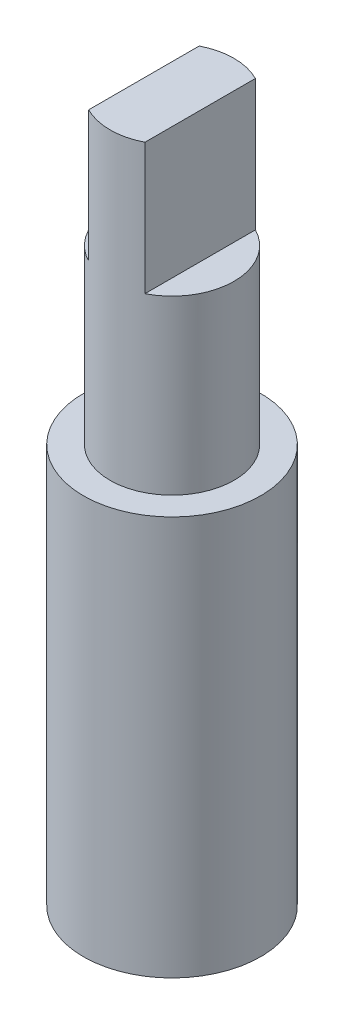
ISO-10303-21;
HEADER;
FILE_DESCRIPTION(('STEP AP214'),'2;1');
FILE_NAME('part.step','',(''),(''),'','','');
FILE_SCHEMA(('AUTOMOTIVE_DESIGN { 1 0 10303 214 1 1 1 1 }'));
ENDSEC;
DATA;
#1=APPLICATION_CONTEXT('core data for automotive mechanical design processes');
#2=APPLICATION_PROTOCOL_DEFINITION('international standard','automotive_design',2000,#1);
#3=PRODUCT_CONTEXT('',#1,'mechanical');
#4=PRODUCT('Part','Part','',(#3));
#5=PRODUCT_RELATED_PRODUCT_CATEGORY('part','',(#4));
#6=PRODUCT_DEFINITION_FORMATION('','',#4);
#7=PRODUCT_DEFINITION_CONTEXT('part definition',#1,'design');
#8=PRODUCT_DEFINITION('design','',#6,#7);
#9=PRODUCT_DEFINITION_SHAPE('','',#8);
#10=(LENGTH_UNIT() NAMED_UNIT(*) SI_UNIT(.MILLI.,.METRE.));
#11=(NAMED_UNIT(*) PLANE_ANGLE_UNIT() SI_UNIT($,.RADIAN.));
#12=(NAMED_UNIT(*) SI_UNIT($,.STERADIAN.) SOLID_ANGLE_UNIT());
#13=UNCERTAINTY_MEASURE_WITH_UNIT(LENGTH_MEASURE(1.E-05),#10,'distance_accuracy_value','');
#14=(GEOMETRIC_REPRESENTATION_CONTEXT(3) GLOBAL_UNCERTAINTY_ASSIGNED_CONTEXT((#13)) GLOBAL_UNIT_ASSIGNED_CONTEXT((#10,
#11,#12)) REPRESENTATION_CONTEXT('',''));
#15=CARTESIAN_POINT('',(0.,0.,0.));
#16=DIRECTION('',(0.,0.,1.));
#17=DIRECTION('',(1.,0.,0.));
#18=AXIS2_PLACEMENT_3D('',#15,#16,#17);
#19=CARTESIAN_POINT('',(0.,19.83,0.));
#20=DIRECTION('',(0.,1.,0.));
#21=DIRECTION('',(0.,0.,1.));
#22=AXIS2_PLACEMENT_3D('',#19,#20,#21);
#23=PLANE('',#22);
#24=DIRECTION('',(0.,0.,-1.));
#25=VECTOR('',#24,1.);
#26=CARTESIAN_POINT('',(0.975,19.83,-1.91621371459449));
#27=LINE('',#26,#25);
#28=CARTESIAN_POINT('',(0.975,19.83,1.91621371459449));
#29=VERTEX_POINT('',#28);
#30=CARTESIAN_POINT('',(0.975,19.83,-1.91621371459449));
#31=VERTEX_POINT('',#30);
#32=EDGE_CURVE('E104',#29,#31,#27,.T.);
#33=ORIENTED_EDGE('',*,*,#32,.F.);
#34=CARTESIAN_POINT('',(0.,19.83,0.));
#35=DIRECTION('',(0.,1.,0.));
#36=DIRECTION('',(0.,0.,1.));
#37=AXIS2_PLACEMENT_3D('',#34,#35,#36);
#38=CIRCLE('',#37,2.15);
#39=EDGE_CURVE('E63',#29,#31,#38,.T.);
#40=ORIENTED_EDGE('',*,*,#39,.T.);
#41=EDGE_LOOP('',(#33,#40));
#42=FACE_BOUND('',#41,.T.);
#43=ADVANCED_FACE('F39',(#42),#23,.T.);
#44=CARTESIAN_POINT('',(0.,13.85,0.));
#45=DIRECTION('',(0.,-1.,0.));
#46=DIRECTION('',(0.,0.,-1.));
#47=AXIS2_PLACEMENT_3D('',#44,#45,#46);
#48=CYLINDRICAL_SURFACE('',#47,3.075);
#49=CARTESIAN_POINT('',(0.,13.85,0.));
#50=DIRECTION('',(0.,1.,0.));
#51=DIRECTION('',(0.,0.,1.));
#52=AXIS2_PLACEMENT_3D('',#49,#50,#51);
#53=CIRCLE('',#52,3.075);
#54=CARTESIAN_POINT('',(0.,13.85,3.075));
#55=VERTEX_POINT('',#54);
#56=EDGE_CURVE('E49',#55,#55,#53,.T.);
#57=ORIENTED_EDGE('',*,*,#56,.F.);
#58=EDGE_LOOP('',(#57));
#59=FACE_BOUND('',#58,.T.);
#60=CARTESIAN_POINT('',(0.,0.,0.));
#61=DIRECTION('',(0.,1.,0.));
#62=DIRECTION('',(0.,0.,1.));
#63=AXIS2_PLACEMENT_3D('',#60,#61,#62);
#64=CIRCLE('',#63,3.075);
#65=CARTESIAN_POINT('',(0.,0.,3.075));
#66=VERTEX_POINT('',#65);
#67=EDGE_CURVE('E43',#66,#66,#64,.T.);
#68=ORIENTED_EDGE('',*,*,#67,.T.);
#69=EDGE_LOOP('',(#68));
#70=FACE_BOUND('',#69,.T.);
#71=ADVANCED_FACE('F41',(#59,#70),#48,.T.);
#72=CARTESIAN_POINT('',(0.,13.85,0.));
#73=DIRECTION('',(0.,1.,0.));
#74=DIRECTION('',(0.,0.,1.));
#75=AXIS2_PLACEMENT_3D('',#72,#73,#74);
#76=PLANE('',#75);
#77=CARTESIAN_POINT('',(0.,13.85,0.));
#78=DIRECTION('',(0.,1.,0.));
#79=DIRECTION('',(0.,0.,1.));
#80=AXIS2_PLACEMENT_3D('',#77,#78,#79);
#81=CIRCLE('',#80,2.15);
#82=CARTESIAN_POINT('',(0.,13.85,2.15));
#83=VERTEX_POINT('',#82);
#84=EDGE_CURVE('E11',#83,#83,#81,.T.);
#85=ORIENTED_EDGE('',*,*,#84,.F.);
#86=EDGE_LOOP('',(#85));
#87=FACE_BOUND('',#86,.T.);
#88=ORIENTED_EDGE('',*,*,#56,.T.);
#89=EDGE_LOOP('',(#88));
#90=FACE_BOUND('',#89,.T.);
#91=ADVANCED_FACE('F129',(#87,#90),#76,.T.);
#92=CARTESIAN_POINT('',(0.,0.,0.));
#93=DIRECTION('',(0.,1.,0.));
#94=DIRECTION('',(0.,0.,1.));
#95=AXIS2_PLACEMENT_3D('',#92,#93,#94);
#96=PLANE('',#95);
#97=CARTESIAN_POINT('',(0.,0.,0.));
#98=DIRECTION('',(0.,-1.,0.));
#99=DIRECTION('',(0.,0.,-1.));
#100=AXIS2_PLACEMENT_3D('',#97,#98,#99);
#101=CIRCLE('',#100,2.15);
#102=CARTESIAN_POINT('',(0.,0.,-2.15));
#103=VERTEX_POINT('',#102);
#104=EDGE_CURVE('E173',#103,#103,#101,.T.);
#105=ORIENTED_EDGE('',*,*,#104,.F.);
#106=EDGE_LOOP('',(#105));
#107=FACE_BOUND('',#106,.T.);
#108=ORIENTED_EDGE('',*,*,#67,.F.);
#109=EDGE_LOOP('',(#108));
#110=FACE_BOUND('',#109,.T.);
#111=ADVANCED_FACE('F127',(#107,#110),#96,.F.);
#112=CARTESIAN_POINT('',(0.,19.83,0.));
#113=DIRECTION('',(0.,-1.,0.));
#114=DIRECTION('',(0.,0.,-1.));
#115=AXIS2_PLACEMENT_3D('',#112,#113,#114);
#116=CYLINDRICAL_SURFACE('',#115,2.15);
#117=ORIENTED_EDGE('',*,*,#39,.F.);
#118=DIRECTION('',(0.,-1.,0.));
#119=VECTOR('',#118,1.);
#120=CARTESIAN_POINT('',(0.975,24.38,1.91621371459449));
#121=LINE('',#120,#119);
#122=CARTESIAN_POINT('',(0.975,24.38,1.91621371459449));
#123=VERTEX_POINT('',#122);
#124=EDGE_CURVE('E114',#123,#29,#121,.T.);
#125=ORIENTED_EDGE('',*,*,#124,.F.);
#126=CARTESIAN_POINT('',(0.,24.38,0.));
#127=DIRECTION('',(0.,1.,0.));
#128=DIRECTION('',(0.,0.,1.));
#129=AXIS2_PLACEMENT_3D('',#126,#127,#128);
#130=CIRCLE('',#129,2.15);
#131=CARTESIAN_POINT('',(-0.975000000000001,24.38,1.91621371459449));
#132=VERTEX_POINT('',#131);
#133=EDGE_CURVE('E93',#132,#123,#130,.T.);
#134=ORIENTED_EDGE('',*,*,#133,.F.);
#135=DIRECTION('',(0.,-1.,0.));
#136=VECTOR('',#135,1.);
#137=CARTESIAN_POINT('',(-0.975000000000001,24.38,1.91621371459449));
#138=LINE('',#137,#136);
#139=CARTESIAN_POINT('',(-0.975000000000001,19.83,1.91621371459449));
#140=VERTEX_POINT('',#139);
#141=EDGE_CURVE('E89',#132,#140,#138,.T.);
#142=ORIENTED_EDGE('',*,*,#141,.T.);
#143=CARTESIAN_POINT('',(-0.975,19.83,-1.91621371459449));
#144=VERTEX_POINT('',#143);
#145=EDGE_CURVE('E108',#144,#140,#38,.T.);
#146=ORIENTED_EDGE('',*,*,#145,.F.);
#147=DIRECTION('',(0.,-1.,0.));
#148=VECTOR('',#147,1.);
#149=CARTESIAN_POINT('',(-0.975,24.38,-1.91621371459449));
#150=LINE('',#149,#148);
#151=CARTESIAN_POINT('',(-0.975,24.38,-1.91621371459449));
#152=VERTEX_POINT('',#151);
#153=EDGE_CURVE('E87',#152,#144,#150,.T.);
#154=ORIENTED_EDGE('',*,*,#153,.F.);
#155=CARTESIAN_POINT('',(0.,24.38,0.));
#156=DIRECTION('',(0.,1.,0.));
#157=DIRECTION('',(0.,0.,1.));
#158=AXIS2_PLACEMENT_3D('',#155,#156,#157);
#159=CIRCLE('',#158,2.15);
#160=CARTESIAN_POINT('',(0.975,24.38,-1.91621371459449));
#161=VERTEX_POINT('',#160);
#162=EDGE_CURVE('E94',#161,#152,#159,.T.);
#163=ORIENTED_EDGE('',*,*,#162,.F.);
#164=DIRECTION('',(0.,-1.,0.));
#165=VECTOR('',#164,1.);
#166=CARTESIAN_POINT('',(0.975,24.38,-1.91621371459449));
#167=LINE('',#166,#165);
#168=EDGE_CURVE('E184',#161,#31,#167,.T.);
#169=ORIENTED_EDGE('',*,*,#168,.T.);
#170=EDGE_LOOP('',(#117,#125,#134,#142,#146,#154,#163,#169));
#171=FACE_BOUND('',#170,.T.);
#172=ORIENTED_EDGE('',*,*,#84,.T.);
#173=EDGE_LOOP('',(#172));
#174=FACE_BOUND('',#173,.T.);
#175=ADVANCED_FACE('F106',(#171,#174),#116,.T.);
#176=DIRECTION('',(0.,0.,1.));
#177=VECTOR('',#176,1.);
#178=CARTESIAN_POINT('',(-0.975,19.83,-1.91621371459449));
#179=LINE('',#178,#177);
#180=EDGE_CURVE('E56',#144,#140,#179,.T.);
#181=ORIENTED_EDGE('',*,*,#180,.F.);
#182=ORIENTED_EDGE('',*,*,#145,.T.);
#183=EDGE_LOOP('',(#181,#182));
#184=FACE_BOUND('',#183,.T.);
#185=ADVANCED_FACE('F135',(#184),#23,.T.);
#186=CARTESIAN_POINT('',(-0.975,24.38,-1.91621371459449));
#187=DIRECTION('',(1.,0.,0.));
#188=DIRECTION('',(0.,0.,-1.));
#189=AXIS2_PLACEMENT_3D('',#186,#187,#188);
#190=PLANE('',#189);
#191=ORIENTED_EDGE('',*,*,#180,.T.);
#192=ORIENTED_EDGE('',*,*,#141,.F.);
#193=DIRECTION('',(0.,0.,1.));
#194=VECTOR('',#193,1.);
#195=CARTESIAN_POINT('',(-0.975,24.38,-1.91621371459449));
#196=LINE('',#195,#194);
#197=EDGE_CURVE('E83',#152,#132,#196,.T.);
#198=ORIENTED_EDGE('',*,*,#197,.F.);
#199=ORIENTED_EDGE('',*,*,#153,.T.);
#200=EDGE_LOOP('',(#191,#192,#198,#199));
#201=FACE_BOUND('',#200,.T.);
#202=ADVANCED_FACE('F85',(#201),#190,.F.);
#203=CARTESIAN_POINT('',(0.975,24.38,-1.91621371459449));
#204=DIRECTION('',(-1.,0.,0.));
#205=DIRECTION('',(0.,0.,1.));
#206=AXIS2_PLACEMENT_3D('',#203,#204,#205);
#207=PLANE('',#206);
#208=ORIENTED_EDGE('',*,*,#32,.T.);
#209=ORIENTED_EDGE('',*,*,#168,.F.);
#210=DIRECTION('',(0.,0.,-1.));
#211=VECTOR('',#210,1.);
#212=CARTESIAN_POINT('',(0.975,24.38,-1.91621371459449));
#213=LINE('',#212,#211);
#214=EDGE_CURVE('E99',#123,#161,#213,.T.);
#215=ORIENTED_EDGE('',*,*,#214,.F.);
#216=ORIENTED_EDGE('',*,*,#124,.T.);
#217=EDGE_LOOP('',(#208,#209,#215,#216));
#218=FACE_BOUND('',#217,.T.);
#219=ADVANCED_FACE('F151',(#218),#207,.F.);
#220=CARTESIAN_POINT('',(0.,24.38,0.));
#221=DIRECTION('',(0.,1.,0.));
#222=DIRECTION('',(0.,0.,1.));
#223=AXIS2_PLACEMENT_3D('',#220,#221,#222);
#224=PLANE('',#223);
#225=ORIENTED_EDGE('',*,*,#162,.T.);
#226=ORIENTED_EDGE('',*,*,#197,.T.);
#227=ORIENTED_EDGE('',*,*,#133,.T.);
#228=ORIENTED_EDGE('',*,*,#214,.T.);
#229=EDGE_LOOP('',(#225,#226,#227,#228));
#230=FACE_BOUND('',#229,.T.);
#231=ADVANCED_FACE('F97',(#230),#224,.T.);
#232=CARTESIAN_POINT('',(0.,1.95,0.));
#233=DIRECTION('',(0.,-1.,0.));
#234=DIRECTION('',(0.,0.,-1.));
#235=AXIS2_PLACEMENT_3D('',#232,#233,#234);
#236=CYLINDRICAL_SURFACE('',#235,2.15);
#237=CARTESIAN_POINT('',(0.,1.95,0.));
#238=DIRECTION('',(0.,-1.,0.));
#239=DIRECTION('',(0.,0.,-1.));
#240=AXIS2_PLACEMENT_3D('',#237,#238,#239);
#241=CIRCLE('',#240,2.15);
#242=CARTESIAN_POINT('',(0.,1.95,-2.15));
#243=VERTEX_POINT('',#242);
#244=EDGE_CURVE('E171',#243,#243,#241,.T.);
#245=ORIENTED_EDGE('',*,*,#244,.F.);
#246=EDGE_LOOP('',(#245));
#247=FACE_BOUND('',#246,.T.);
#248=ORIENTED_EDGE('',*,*,#104,.T.);
#249=EDGE_LOOP('',(#248));
#250=FACE_BOUND('',#249,.T.);
#251=ADVANCED_FACE('F160',(#247,#250),#236,.F.);
#252=CARTESIAN_POINT('',(0.,1.95,0.));
#253=DIRECTION('',(0.,-1.,0.));
#254=DIRECTION('',(0.,0.,-1.));
#255=AXIS2_PLACEMENT_3D('',#252,#253,#254);
#256=PLANE('',#255);
#257=ORIENTED_EDGE('',*,*,#244,.T.);
#258=EDGE_LOOP('',(#257));
#259=FACE_BOUND('',#258,.T.);
#260=ADVANCED_FACE('F163',(#259),#256,.T.);
#261=CLOSED_SHELL('',(#43,#71,#91,#111,#175,#185,#202,#219,#231,#251,#260));
#262=MANIFOLD_SOLID_BREP('B2',#261);
#263=ADVANCED_BREP_SHAPE_REPRESENTATION('',(#18,#262),#14);
#264=SHAPE_DEFINITION_REPRESENTATION(#9,#263);
ENDSEC;
END-ISO-10303-21;
